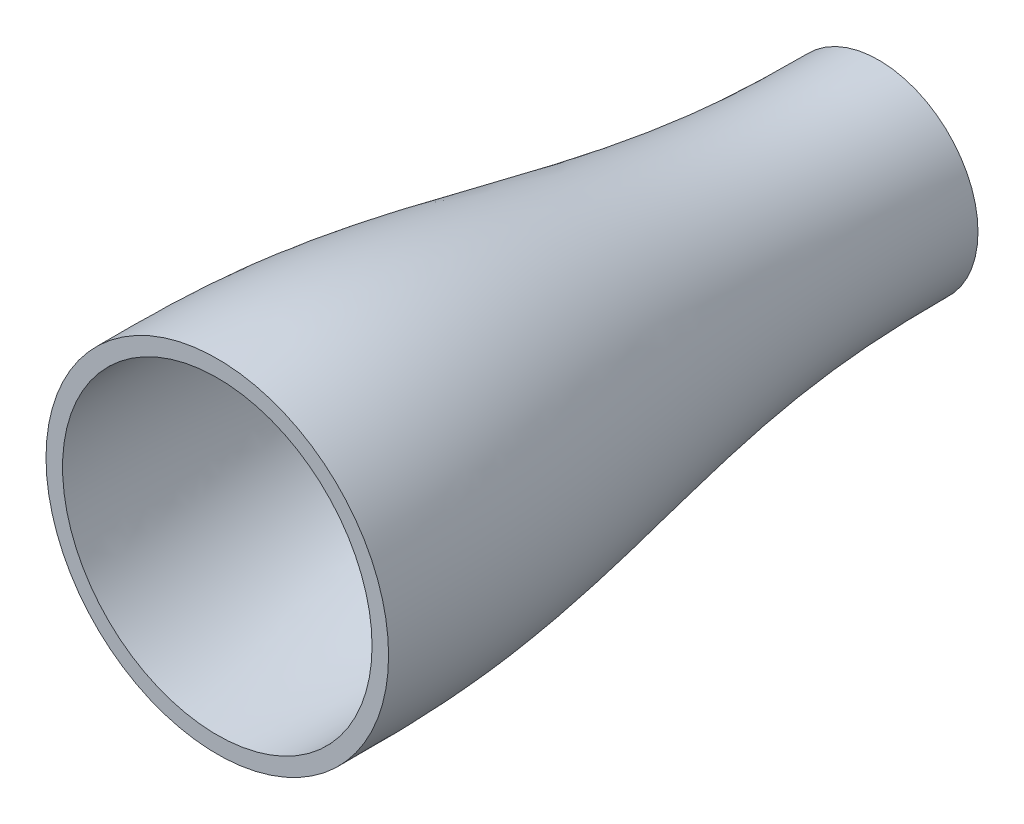
ISO-10303-21;
HEADER;
FILE_DESCRIPTION(('STEP AP214'),'2;1');
FILE_NAME('part.step','',(''),(''),'','','');
FILE_SCHEMA(('AUTOMOTIVE_DESIGN { 1 0 10303 214 1 1 1 1 }'));
ENDSEC;
DATA;
#1=APPLICATION_CONTEXT('core data for automotive mechanical design processes');
#2=APPLICATION_PROTOCOL_DEFINITION('international standard','automotive_design',2000,#1);
#3=PRODUCT_CONTEXT('',#1,'mechanical');
#4=PRODUCT('Part','Part','',(#3));
#5=PRODUCT_RELATED_PRODUCT_CATEGORY('part','',(#4));
#6=PRODUCT_DEFINITION_FORMATION('','',#4);
#7=PRODUCT_DEFINITION_CONTEXT('part definition',#1,'design');
#8=PRODUCT_DEFINITION('design','',#6,#7);
#9=PRODUCT_DEFINITION_SHAPE('','',#8);
#10=(LENGTH_UNIT() NAMED_UNIT(*) SI_UNIT(.MILLI.,.METRE.));
#11=(NAMED_UNIT(*) PLANE_ANGLE_UNIT() SI_UNIT($,.RADIAN.));
#12=(NAMED_UNIT(*) SI_UNIT($,.STERADIAN.) SOLID_ANGLE_UNIT());
#13=UNCERTAINTY_MEASURE_WITH_UNIT(LENGTH_MEASURE(1.E-05),#10,'distance_accuracy_value','');
#14=(GEOMETRIC_REPRESENTATION_CONTEXT(3) GLOBAL_UNCERTAINTY_ASSIGNED_CONTEXT((#13)) GLOBAL_UNIT_ASSIGNED_CONTEXT((#10,
#11,#12)) REPRESENTATION_CONTEXT('',''));
#15=CARTESIAN_POINT('',(0.,0.,0.));
#16=DIRECTION('',(0.,0.,1.));
#17=DIRECTION('',(1.,0.,0.));
#18=AXIS2_PLACEMENT_3D('',#15,#16,#17);
#19=CARTESIAN_POINT('',(0.,0.,-1200.00000000001));
#20=DIRECTION('',(0.,0.,1.));
#21=DIRECTION('',(1.,0.,0.));
#22=AXIS2_PLACEMENT_3D('',#19,#20,#21);
#23=PLANE('',#22);
#24=CARTESIAN_POINT('',(0.,0.,-1200.));
#25=DIRECTION('',(0.,0.,1.));
#26=DIRECTION('',(1.,0.,0.));
#27=AXIS2_PLACEMENT_3D('',#24,#25,#26);
#28=CIRCLE('',#27,149.99999936967);
#29=CARTESIAN_POINT('',(149.99999936967,0.,-1200.));
#30=VERTEX_POINT('',#29);
#31=EDGE_CURVE('E51',#30,#30,#28,.T.);
#32=ORIENTED_EDGE('',*,*,#31,.T.);
#33=EDGE_LOOP('',(#32));
#34=FACE_BOUND('',#33,.T.);
#35=CARTESIAN_POINT('',(0.,0.,-1200.00000000001));
#36=DIRECTION('',(0.,0.,1.));
#37=DIRECTION('',(1.,0.,0.));
#38=AXIS2_PLACEMENT_3D('',#35,#36,#37);
#39=CIRCLE('',#38,180.);
#40=CARTESIAN_POINT('',(180.,0.,-1200.00000000001));
#41=VERTEX_POINT('',#40);
#42=EDGE_CURVE('E10',#41,#41,#39,.T.);
#43=ORIENTED_EDGE('',*,*,#42,.F.);
#44=EDGE_LOOP('',(#43));
#45=FACE_BOUND('',#44,.T.);
#46=ADVANCED_FACE('F41',(#34,#45),#23,.F.);
#47=CARTESIAN_POINT('',(0.,180.,-1200.00000000001));
#48=CARTESIAN_POINT('',(0.,179.950702731435,-960.098651242016));
#49=CARTESIAN_POINT('',(0.,191.544410274479,-720.153458385391));
#50=CARTESIAN_POINT('',(0.,312.546770254683,-479.796265033484));
#51=CARTESIAN_POINT('',(0.,311.643385127342,-239.898132516742));
#52=CARTESIAN_POINT('',(0.,310.74,0.));
#53=CARTESIAN_POINT('',(0.,310.730966148727,2.39898132516742));
#54=CARTESIAN_POINT('',(0.,310.721932297453,4.79796265033484));
#55=CARTESIAN_POINT('',(0.,310.71289844618,7.19694397550225));
#56=CARTESIAN_POINT('',(0.,310.703864594906,9.59592530066967));
#57=CARTESIAN_POINT('',(0.,310.694830743633,11.9949066258371));
#58=B_SPLINE_CURVE_WITH_KNOTS('',5,(#47,#48,#49,#50,#51,#52,#53,#54,#55,#56,#57),.UNSPECIFIED.,
.F.,.F.,(6,5,6),(0.,0.965828537833743,0.97548682321208),.UNSPECIFIED.);
#59=CARTESIAN_POINT('',(0.,0.,0.));
#60=DIRECTION('',(0.,0.,1.));
#61=AXIS1_PLACEMENT('',#59,#60);
#62=SURFACE_OF_REVOLUTION('',#58,#61);
#63=CARTESIAN_POINT('',(0.,0.,0.));
#64=DIRECTION('',(0.,0.,1.));
#65=DIRECTION('',(1.,0.,0.));
#66=AXIS2_PLACEMENT_3D('',#63,#64,#65);
#67=CIRCLE('',#66,310.74);
#68=CARTESIAN_POINT('',(310.74,0.,0.));
#69=VERTEX_POINT('',#68);
#70=EDGE_CURVE('E50',#69,#69,#67,.T.);
#71=ORIENTED_EDGE('',*,*,#70,.F.);
#72=EDGE_LOOP('',(#71));
#73=FACE_BOUND('',#72,.T.);
#74=ORIENTED_EDGE('',*,*,#42,.T.);
#75=EDGE_LOOP('',(#74));
#76=FACE_BOUND('',#75,.T.);
#77=ADVANCED_FACE('F68',(#73,#76),#62,.T.);
#78=CARTESIAN_POINT('',(0.,310.74,0.));
#79=DIRECTION('',(0.,0.,-1.));
#80=DIRECTION('',(-1.,0.,0.));
#81=AXIS2_PLACEMENT_3D('',#78,#79,#80);
#82=PLANE('',#81);
#83=CARTESIAN_POINT('',(0.,0.,1.06976535342356E-13));
#84=DIRECTION('',(0.,0.,1.));
#85=DIRECTION('',(1.,0.,0.));
#86=AXIS2_PLACEMENT_3D('',#83,#84,#85);
#87=CIRCLE('',#86,280.739787292963);
#88=CARTESIAN_POINT('',(280.739787292963,0.,1.06976535342356E-13));
#89=VERTEX_POINT('',#88);
#90=EDGE_CURVE('E54',#89,#89,#87,.T.);
#91=ORIENTED_EDGE('',*,*,#90,.F.);
#92=EDGE_LOOP('',(#91));
#93=FACE_BOUND('',#92,.T.);
#94=ORIENTED_EDGE('',*,*,#70,.T.);
#95=EDGE_LOOP('',(#94));
#96=FACE_BOUND('',#95,.T.);
#97=ADVANCED_FACE('F69',(#93,#96),#82,.F.);
#98=CARTESIAN_POINT('',(0.,180.,-1200.00000000001));
#99=CARTESIAN_POINT('',(0.,179.950702731435,-960.098651242016));
#100=CARTESIAN_POINT('',(0.,191.544410274479,-720.153458385391));
#101=CARTESIAN_POINT('',(0.,312.546770254683,-479.796265033484));
#102=CARTESIAN_POINT('',(0.,311.643385127342,-239.898132516742));
#103=CARTESIAN_POINT('',(0.,310.730966148727,2.39898132516742));
#104=CARTESIAN_POINT('',(0.,310.721932297453,4.79796265033484));
#105=CARTESIAN_POINT('',(0.,310.71289844618,7.19694397550225));
#106=CARTESIAN_POINT('',(0.,310.703864594906,9.59592530066967));
#107=CARTESIAN_POINT('',(0.,310.694830743633,11.9949066258371));
#108=B_SPLINE_CURVE_WITH_KNOTS('',5,(#98,#99,#100,#101,#102,#103,#104,#105,#106,#107),
.UNSPECIFIED.,.F.,.F.,(6,4,6),(0.,0.965828537833743,0.97548682321208),.UNSPECIFIED.);
#109=CARTESIAN_POINT('',(0.,0.,0.));
#110=DIRECTION('',(0.,0.,1.));
#111=AXIS1_PLACEMENT('',#109,#110);
#112=SURFACE_OF_REVOLUTION('',#108,#111);
#113=OFFSET_SURFACE('',#112,-30.,.F.);
#114=ORIENTED_EDGE('',*,*,#90,.T.);
#115=EDGE_LOOP('',(#114));
#116=FACE_BOUND('',#115,.T.);
#117=ORIENTED_EDGE('',*,*,#31,.F.);
#118=EDGE_LOOP('',(#117));
#119=FACE_BOUND('',#118,.T.);
#120=ADVANCED_FACE('F75',(#116,#119),#113,.F.);
#121=CLOSED_SHELL('',(#46,#77,#97,#120));
#122=MANIFOLD_SOLID_BREP('B2',#121);
#123=ADVANCED_BREP_SHAPE_REPRESENTATION('',(#18,#122),#14);
#124=SHAPE_DEFINITION_REPRESENTATION(#9,#123);
ENDSEC;
END-ISO-10303-21;
